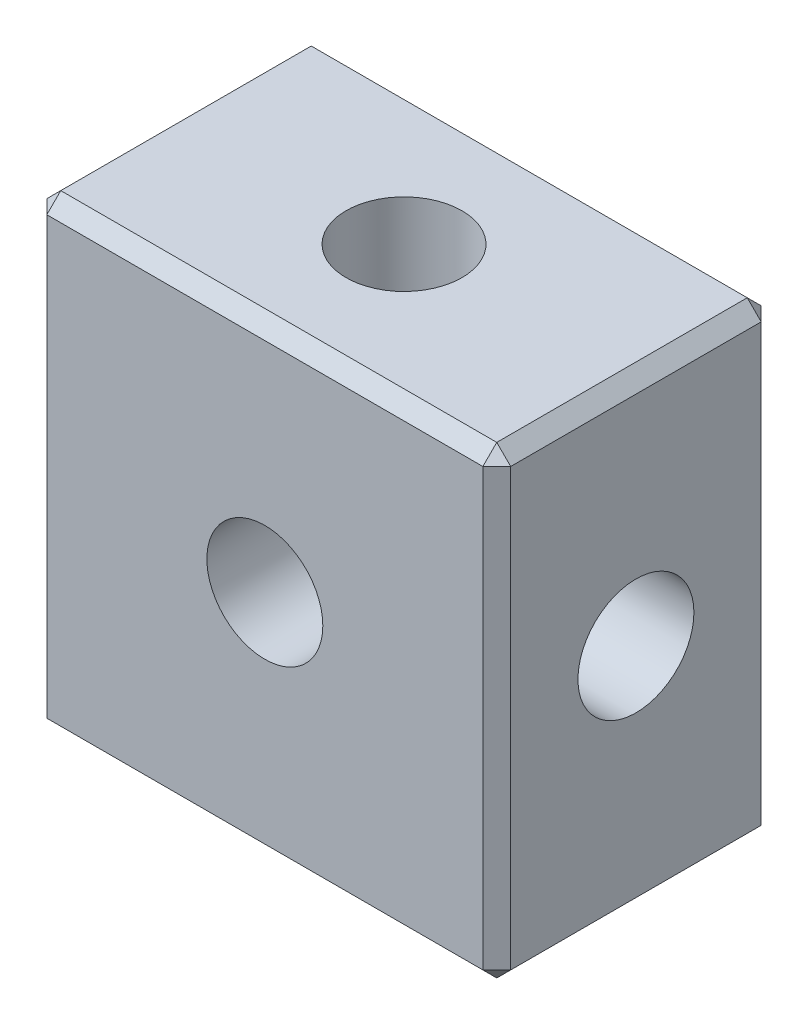
ISO-10303-21;
HEADER;
FILE_DESCRIPTION(('STEP AP214'),'2;1');
FILE_NAME('part.step','',(''),(''),'','','');
FILE_SCHEMA(('AUTOMOTIVE_DESIGN { 1 0 10303 214 1 1 1 1 }'));
ENDSEC;
DATA;
#1=APPLICATION_CONTEXT('core data for automotive mechanical design processes');
#2=APPLICATION_PROTOCOL_DEFINITION('international standard','automotive_design',2000,#1);
#3=PRODUCT_CONTEXT('',#1,'mechanical');
#4=PRODUCT('Part','Part','',(#3));
#5=PRODUCT_RELATED_PRODUCT_CATEGORY('part','',(#4));
#6=PRODUCT_DEFINITION_FORMATION('','',#4);
#7=PRODUCT_DEFINITION_CONTEXT('part definition',#1,'design');
#8=PRODUCT_DEFINITION('design','',#6,#7);
#9=PRODUCT_DEFINITION_SHAPE('','',#8);
#10=(LENGTH_UNIT() NAMED_UNIT(*) SI_UNIT(.MILLI.,.METRE.));
#11=(NAMED_UNIT(*) PLANE_ANGLE_UNIT() SI_UNIT($,.RADIAN.));
#12=(NAMED_UNIT(*) SI_UNIT($,.STERADIAN.) SOLID_ANGLE_UNIT());
#13=UNCERTAINTY_MEASURE_WITH_UNIT(LENGTH_MEASURE(1.E-05),#10,'distance_accuracy_value','');
#14=(GEOMETRIC_REPRESENTATION_CONTEXT(3) GLOBAL_UNCERTAINTY_ASSIGNED_CONTEXT((#13)) GLOBAL_UNIT_ASSIGNED_CONTEXT((#10,
#11,#12)) REPRESENTATION_CONTEXT('',''));
#15=CARTESIAN_POINT('',(0.,0.,0.));
#16=DIRECTION('',(0.,0.,1.));
#17=DIRECTION('',(1.,0.,0.));
#18=AXIS2_PLACEMENT_3D('',#15,#16,#17);
#19=CARTESIAN_POINT('',(0.,0.,3.));
#20=DIRECTION('',(0.,0.,1.));
#21=DIRECTION('',(1.,0.,0.));
#22=AXIS2_PLACEMENT_3D('',#19,#20,#21);
#23=CYLINDRICAL_SURFACE('',#22,1.24999999999999);
#24=CARTESIAN_POINT('',(0.,0.,3.));
#25=DIRECTION('',(0.,0.,1.));
#26=DIRECTION('',(1.,0.,0.));
#27=AXIS2_PLACEMENT_3D('',#24,#25,#26);
#28=CIRCLE('',#27,1.24999999999999);
#29=CARTESIAN_POINT('',(1.24999999999999,0.,3.));
#30=VERTEX_POINT('',#29);
#31=EDGE_CURVE('E335',#30,#30,#28,.T.);
#32=ORIENTED_EDGE('',*,*,#31,.T.);
#33=EDGE_LOOP('',(#32));
#34=FACE_BOUND('',#33,.T.);
#35=CARTESIAN_POINT('',(0.,0.,0.));
#36=DIRECTION('',(0.707106781186547,0.,0.707106781186547));
#37=DIRECTION('',(-0.707106781186547,0.,0.707106781186547));
#38=AXIS2_PLACEMENT_3D('',#35,#36,#37);
#39=ELLIPSE('',#38,1.76776695296636,1.24999999999999);
#40=CARTESIAN_POINT('',(-0.883883476483179,-0.883883476483179,0.883883476483179));
#41=VERTEX_POINT('',#40);
#42=CARTESIAN_POINT('',(-0.883883476483179,0.883883476483179,0.883883476483179));
#43=VERTEX_POINT('',#42);
#44=EDGE_CURVE('E166',#41,#43,#39,.F.);
#45=ORIENTED_EDGE('',*,*,#44,.T.);
#46=CARTESIAN_POINT('',(0.,0.,0.));
#47=DIRECTION('',(0.,-0.707106781186547,0.707106781186547));
#48=DIRECTION('',(0.,0.707106781186547,0.707106781186547));
#49=AXIS2_PLACEMENT_3D('',#46,#47,#48);
#50=ELLIPSE('',#49,1.76776695296636,1.24999999999999);
#51=CARTESIAN_POINT('',(0.883883476483179,0.883883476483179,0.883883476483179));
#52=VERTEX_POINT('',#51);
#53=EDGE_CURVE('E326',#43,#52,#50,.F.);
#54=ORIENTED_EDGE('',*,*,#53,.T.);
#55=CARTESIAN_POINT('',(0.,0.,0.));
#56=DIRECTION('',(-0.707106781186547,0.,0.707106781186547));
#57=DIRECTION('',(0.707106781186547,0.,0.707106781186547));
#58=AXIS2_PLACEMENT_3D('',#55,#56,#57);
#59=ELLIPSE('',#58,1.76776695296636,1.24999999999999);
#60=CARTESIAN_POINT('',(0.883883476483179,-0.883883476483179,0.883883476483179));
#61=VERTEX_POINT('',#60);
#62=EDGE_CURVE('E184',#52,#61,#59,.F.);
#63=ORIENTED_EDGE('',*,*,#62,.T.);
#64=CARTESIAN_POINT('',(0.,0.,0.));
#65=DIRECTION('',(0.,0.707106781186547,0.707106781186547));
#66=DIRECTION('',(0.,-0.707106781186547,0.707106781186547));
#67=AXIS2_PLACEMENT_3D('',#64,#65,#66);
#68=ELLIPSE('',#67,1.76776695296636,1.24999999999999);
#69=EDGE_CURVE('E160',#61,#41,#68,.F.);
#70=ORIENTED_EDGE('',*,*,#69,.T.);
#71=EDGE_LOOP('',(#45,#54,#63,#70));
#72=FACE_BOUND('',#71,.T.);
#73=ADVANCED_FACE('F42',(#34,#72),#23,.F.);
#74=CARTESIAN_POINT('',(5.,-5.,3.));
#75=DIRECTION('',(-1.,0.,0.));
#76=DIRECTION('',(0.,-1.,0.));
#77=AXIS2_PLACEMENT_3D('',#74,#75,#76);
#78=PLANE('',#77);
#79=DIRECTION('',(0.,-1.,0.));
#80=VECTOR('',#79,1.);
#81=CARTESIAN_POINT('',(5.,-5.,2.7));
#82=LINE('',#81,#80);
#83=CARTESIAN_POINT('',(5.,4.7,2.7));
#84=VERTEX_POINT('',#83);
#85=CARTESIAN_POINT('',(5.,-4.7,2.7));
#86=VERTEX_POINT('',#85);
#87=EDGE_CURVE('E218',#84,#86,#82,.T.);
#88=ORIENTED_EDGE('',*,*,#87,.T.);
#89=DIRECTION('',(0.,0.,-1.));
#90=VECTOR('',#89,1.);
#91=CARTESIAN_POINT('',(5.,-4.7,3.));
#92=LINE('',#91,#90);
#93=CARTESIAN_POINT('',(5.,-4.7,-2.7));
#94=VERTEX_POINT('',#93);
#95=EDGE_CURVE('E222',#86,#94,#92,.T.);
#96=ORIENTED_EDGE('',*,*,#95,.T.);
#97=DIRECTION('',(0.,1.,0.));
#98=VECTOR('',#97,1.);
#99=CARTESIAN_POINT('',(5.,5.,-2.7));
#100=LINE('',#99,#98);
#101=CARTESIAN_POINT('',(5.,4.7,-2.7));
#102=VERTEX_POINT('',#101);
#103=EDGE_CURVE('E220',#94,#102,#100,.T.);
#104=ORIENTED_EDGE('',*,*,#103,.T.);
#105=DIRECTION('',(0.,0.,1.));
#106=VECTOR('',#105,1.);
#107=CARTESIAN_POINT('',(5.,4.7,3.));
#108=LINE('',#107,#106);
#109=EDGE_CURVE('E216',#102,#84,#108,.T.);
#110=ORIENTED_EDGE('',*,*,#109,.T.);
#111=EDGE_LOOP('',(#88,#96,#104,#110));
#112=FACE_BOUND('',#111,.T.);
#113=CARTESIAN_POINT('',(5.,0.,0.));
#114=DIRECTION('',(1.,0.,0.));
#115=DIRECTION('',(0.,0.,-1.));
#116=AXIS2_PLACEMENT_3D('',#113,#114,#115);
#117=CIRCLE('',#116,1.24999999999999);
#118=CARTESIAN_POINT('',(5.,0.,-1.24999999999999));
#119=VERTEX_POINT('',#118);
#120=EDGE_CURVE('E329',#119,#119,#117,.T.);
#121=ORIENTED_EDGE('',*,*,#120,.F.);
#122=EDGE_LOOP('',(#121));
#123=FACE_BOUND('',#122,.T.);
#124=ADVANCED_FACE('F358',(#112,#123),#78,.F.);
#125=CARTESIAN_POINT('',(-5.,5.,3.));
#126=DIRECTION('',(0.,-1.,0.));
#127=DIRECTION('',(1.,0.,0.));
#128=AXIS2_PLACEMENT_3D('',#125,#126,#127);
#129=PLANE('',#128);
#130=DIRECTION('',(0.,0.,1.));
#131=VECTOR('',#130,1.);
#132=CARTESIAN_POINT('',(-4.7,5.,3.));
#133=LINE('',#132,#131);
#134=CARTESIAN_POINT('',(-4.7,5.,-2.7));
#135=VERTEX_POINT('',#134);
#136=CARTESIAN_POINT('',(-4.7,5.,2.7));
#137=VERTEX_POINT('',#136);
#138=EDGE_CURVE('E52',#135,#137,#133,.T.);
#139=ORIENTED_EDGE('',*,*,#138,.T.);
#140=DIRECTION('',(1.,0.,0.));
#141=VECTOR('',#140,1.);
#142=CARTESIAN_POINT('',(-5.,5.,2.7));
#143=LINE('',#142,#141);
#144=CARTESIAN_POINT('',(4.7,5.,2.7));
#145=VERTEX_POINT('',#144);
#146=EDGE_CURVE('E11',#137,#145,#143,.T.);
#147=ORIENTED_EDGE('',*,*,#146,.T.);
#148=DIRECTION('',(0.,0.,-1.));
#149=VECTOR('',#148,1.);
#150=CARTESIAN_POINT('',(4.7,5.,3.));
#151=LINE('',#150,#149);
#152=CARTESIAN_POINT('',(4.7,5.,-2.7));
#153=VERTEX_POINT('',#152);
#154=EDGE_CURVE('E234',#145,#153,#151,.T.);
#155=ORIENTED_EDGE('',*,*,#154,.T.);
#156=DIRECTION('',(-1.,0.,0.));
#157=VECTOR('',#156,1.);
#158=CARTESIAN_POINT('',(-5.,5.,-2.7));
#159=LINE('',#158,#157);
#160=EDGE_CURVE('E63',#153,#135,#159,.T.);
#161=ORIENTED_EDGE('',*,*,#160,.T.);
#162=EDGE_LOOP('',(#139,#147,#155,#161));
#163=FACE_BOUND('',#162,.T.);
#164=CARTESIAN_POINT('',(0.,5.,0.));
#165=DIRECTION('',(0.,-1.,0.));
#166=DIRECTION('',(0.,0.,-1.));
#167=AXIS2_PLACEMENT_3D('',#164,#165,#166);
#168=CIRCLE('',#167,1.25);
#169=CARTESIAN_POINT('',(0.,5.,-1.25));
#170=VERTEX_POINT('',#169);
#171=EDGE_CURVE('E177',#170,#170,#168,.T.);
#172=ORIENTED_EDGE('',*,*,#171,.T.);
#173=EDGE_LOOP('',(#172));
#174=FACE_BOUND('',#173,.T.);
#175=ADVANCED_FACE('F363',(#163,#174),#129,.F.);
#176=CARTESIAN_POINT('',(-5.,-5.,3.));
#177=DIRECTION('',(1.,0.,0.));
#178=DIRECTION('',(0.,0.,-1.));
#179=AXIS2_PLACEMENT_3D('',#176,#177,#178);
#180=PLANE('',#179);
#181=DIRECTION('',(0.,-1.,0.));
#182=VECTOR('',#181,1.);
#183=CARTESIAN_POINT('',(-5.,-5.,-2.7));
#184=LINE('',#183,#182);
#185=CARTESIAN_POINT('',(-5.,4.7,-2.7));
#186=VERTEX_POINT('',#185);
#187=CARTESIAN_POINT('',(-5.,-4.7,-2.7));
#188=VERTEX_POINT('',#187);
#189=EDGE_CURVE('E202',#186,#188,#184,.T.);
#190=ORIENTED_EDGE('',*,*,#189,.T.);
#191=DIRECTION('',(0.,0.,1.));
#192=VECTOR('',#191,1.);
#193=CARTESIAN_POINT('',(-5.,-4.7,3.));
#194=LINE('',#193,#192);
#195=CARTESIAN_POINT('',(-5.,-4.7,2.7));
#196=VERTEX_POINT('',#195);
#197=EDGE_CURVE('E204',#188,#196,#194,.T.);
#198=ORIENTED_EDGE('',*,*,#197,.T.);
#199=DIRECTION('',(0.,1.,0.));
#200=VECTOR('',#199,1.);
#201=CARTESIAN_POINT('',(-5.,-5.,2.7));
#202=LINE('',#201,#200);
#203=CARTESIAN_POINT('',(-5.,4.7,2.7));
#204=VERTEX_POINT('',#203);
#205=EDGE_CURVE('E200',#196,#204,#202,.T.);
#206=ORIENTED_EDGE('',*,*,#205,.T.);
#207=DIRECTION('',(0.,0.,-1.));
#208=VECTOR('',#207,1.);
#209=CARTESIAN_POINT('',(-5.,4.7,3.));
#210=LINE('',#209,#208);
#211=EDGE_CURVE('E198',#204,#186,#210,.T.);
#212=ORIENTED_EDGE('',*,*,#211,.T.);
#213=EDGE_LOOP('',(#190,#198,#206,#212));
#214=FACE_BOUND('',#213,.T.);
#215=CARTESIAN_POINT('',(-5.,0.,0.));
#216=DIRECTION('',(1.,0.,0.));
#217=DIRECTION('',(0.,0.,-1.));
#218=AXIS2_PLACEMENT_3D('',#215,#216,#217);
#219=CIRCLE('',#218,1.25);
#220=CARTESIAN_POINT('',(-5.,0.,-1.25));
#221=VERTEX_POINT('',#220);
#222=EDGE_CURVE('E332',#221,#221,#219,.T.);
#223=ORIENTED_EDGE('',*,*,#222,.T.);
#224=EDGE_LOOP('',(#223));
#225=FACE_BOUND('',#224,.T.);
#226=ADVANCED_FACE('F384',(#214,#225),#180,.F.);
#227=CARTESIAN_POINT('',(-5.,-5.,3.));
#228=DIRECTION('',(0.,1.,0.));
#229=DIRECTION('',(-1.,0.,0.));
#230=AXIS2_PLACEMENT_3D('',#227,#228,#229);
#231=PLANE('',#230);
#232=DIRECTION('',(-1.,0.,0.));
#233=VECTOR('',#232,1.);
#234=CARTESIAN_POINT('',(-5.,-5.,2.7));
#235=LINE('',#234,#233);
#236=CARTESIAN_POINT('',(4.7,-5.,2.7));
#237=VERTEX_POINT('',#236);
#238=CARTESIAN_POINT('',(-4.7,-5.,2.7));
#239=VERTEX_POINT('',#238);
#240=EDGE_CURVE('E189',#237,#239,#235,.T.);
#241=ORIENTED_EDGE('',*,*,#240,.T.);
#242=DIRECTION('',(0.,0.,-1.));
#243=VECTOR('',#242,1.);
#244=CARTESIAN_POINT('',(-4.7,-5.,3.));
#245=LINE('',#244,#243);
#246=CARTESIAN_POINT('',(-4.7,-5.,-2.7));
#247=VERTEX_POINT('',#246);
#248=EDGE_CURVE('E195',#239,#247,#245,.T.);
#249=ORIENTED_EDGE('',*,*,#248,.T.);
#250=DIRECTION('',(1.,0.,0.));
#251=VECTOR('',#250,1.);
#252=CARTESIAN_POINT('',(5.,-5.,-2.7));
#253=LINE('',#252,#251);
#254=CARTESIAN_POINT('',(4.7,-5.,-2.7));
#255=VERTEX_POINT('',#254);
#256=EDGE_CURVE('E193',#247,#255,#253,.T.);
#257=ORIENTED_EDGE('',*,*,#256,.T.);
#258=DIRECTION('',(0.,0.,1.));
#259=VECTOR('',#258,1.);
#260=CARTESIAN_POINT('',(4.7,-5.,3.));
#261=LINE('',#260,#259);
#262=EDGE_CURVE('E191',#255,#237,#261,.T.);
#263=ORIENTED_EDGE('',*,*,#262,.T.);
#264=EDGE_LOOP('',(#241,#249,#257,#263));
#265=FACE_BOUND('',#264,.T.);
#266=CARTESIAN_POINT('',(0.,-5.,0.));
#267=DIRECTION('',(0.,-1.,0.));
#268=DIRECTION('',(0.,0.,-1.));
#269=AXIS2_PLACEMENT_3D('',#266,#267,#268);
#270=CIRCLE('',#269,1.24999999999999);
#271=CARTESIAN_POINT('',(0.,-5.,-1.24999999999999));
#272=VERTEX_POINT('',#271);
#273=EDGE_CURVE('E305',#272,#272,#270,.T.);
#274=ORIENTED_EDGE('',*,*,#273,.F.);
#275=EDGE_LOOP('',(#274));
#276=FACE_BOUND('',#275,.T.);
#277=ADVANCED_FACE('F378',(#265,#276),#231,.F.);
#278=CARTESIAN_POINT('',(0.,0.,3.));
#279=DIRECTION('',(0.,0.,-1.));
#280=DIRECTION('',(-1.,0.,0.));
#281=AXIS2_PLACEMENT_3D('',#278,#279,#280);
#282=PLANE('',#281);
#283=DIRECTION('',(1.,0.,0.));
#284=VECTOR('',#283,1.);
#285=CARTESIAN_POINT('',(0.,-4.7,3.));
#286=LINE('',#285,#284);
#287=CARTESIAN_POINT('',(-4.7,-4.7,3.));
#288=VERTEX_POINT('',#287);
#289=CARTESIAN_POINT('',(4.7,-4.7,3.));
#290=VERTEX_POINT('',#289);
#291=EDGE_CURVE('E229',#288,#290,#286,.T.);
#292=ORIENTED_EDGE('',*,*,#291,.T.);
#293=DIRECTION('',(0.,1.,0.));
#294=VECTOR('',#293,1.);
#295=CARTESIAN_POINT('',(4.7,0.,3.));
#296=LINE('',#295,#294);
#297=CARTESIAN_POINT('',(4.7,4.7,3.));
#298=VERTEX_POINT('',#297);
#299=EDGE_CURVE('E231',#290,#298,#296,.T.);
#300=ORIENTED_EDGE('',*,*,#299,.T.);
#301=DIRECTION('',(-1.,0.,0.));
#302=VECTOR('',#301,1.);
#303=CARTESIAN_POINT('',(0.,4.7,3.));
#304=LINE('',#303,#302);
#305=CARTESIAN_POINT('',(-4.7,4.7,3.));
#306=VERTEX_POINT('',#305);
#307=EDGE_CURVE('E225',#298,#306,#304,.T.);
#308=ORIENTED_EDGE('',*,*,#307,.T.);
#309=DIRECTION('',(0.,-1.,0.));
#310=VECTOR('',#309,1.);
#311=CARTESIAN_POINT('',(-4.7,0.,3.));
#312=LINE('',#311,#310);
#313=EDGE_CURVE('E227',#306,#288,#312,.T.);
#314=ORIENTED_EDGE('',*,*,#313,.T.);
#315=EDGE_LOOP('',(#292,#300,#308,#314));
#316=FACE_BOUND('',#315,.T.);
#317=ORIENTED_EDGE('',*,*,#31,.F.);
#318=EDGE_LOOP('',(#317));
#319=FACE_BOUND('',#318,.T.);
#320=ADVANCED_FACE('F372',(#316,#319),#282,.F.);
#321=CARTESIAN_POINT('',(0.,0.,-3.));
#322=DIRECTION('',(0.,0.,-1.));
#323=DIRECTION('',(-1.,0.,0.));
#324=AXIS2_PLACEMENT_3D('',#321,#322,#323);
#325=PLANE('',#324);
#326=DIRECTION('',(-1.,0.,0.));
#327=VECTOR('',#326,1.);
#328=CARTESIAN_POINT('',(-5.,-4.7,-3.));
#329=LINE('',#328,#327);
#330=CARTESIAN_POINT('',(4.7,-4.7,-3.));
#331=VERTEX_POINT('',#330);
#332=CARTESIAN_POINT('',(-4.7,-4.7,-3.));
#333=VERTEX_POINT('',#332);
#334=EDGE_CURVE('E211',#331,#333,#329,.T.);
#335=ORIENTED_EDGE('',*,*,#334,.T.);
#336=DIRECTION('',(0.,1.,0.));
#337=VECTOR('',#336,1.);
#338=CARTESIAN_POINT('',(-4.7,5.,-3.));
#339=LINE('',#338,#337);
#340=CARTESIAN_POINT('',(-4.7,4.7,-3.));
#341=VERTEX_POINT('',#340);
#342=EDGE_CURVE('E213',#333,#341,#339,.T.);
#343=ORIENTED_EDGE('',*,*,#342,.T.);
#344=DIRECTION('',(1.,0.,0.));
#345=VECTOR('',#344,1.);
#346=CARTESIAN_POINT('',(5.,4.7,-3.));
#347=LINE('',#346,#345);
#348=CARTESIAN_POINT('',(4.7,4.7,-3.));
#349=VERTEX_POINT('',#348);
#350=EDGE_CURVE('E207',#341,#349,#347,.T.);
#351=ORIENTED_EDGE('',*,*,#350,.T.);
#352=DIRECTION('',(0.,-1.,0.));
#353=VECTOR('',#352,1.);
#354=CARTESIAN_POINT('',(4.7,-5.,-3.));
#355=LINE('',#354,#353);
#356=EDGE_CURVE('E209',#349,#331,#355,.T.);
#357=ORIENTED_EDGE('',*,*,#356,.T.);
#358=EDGE_LOOP('',(#335,#343,#351,#357));
#359=FACE_BOUND('',#358,.T.);
#360=CARTESIAN_POINT('',(0.,0.,-3.));
#361=DIRECTION('',(0.,0.,1.));
#362=DIRECTION('',(1.,0.,0.));
#363=AXIS2_PLACEMENT_3D('',#360,#361,#362);
#364=CIRCLE('',#363,1.25);
#365=CARTESIAN_POINT('',(1.25,0.,-3.));
#366=VERTEX_POINT('',#365);
#367=EDGE_CURVE('E338',#366,#366,#364,.T.);
#368=ORIENTED_EDGE('',*,*,#367,.T.);
#369=EDGE_LOOP('',(#368));
#370=FACE_BOUND('',#369,.T.);
#371=ADVANCED_FACE('F368',(#359,#370),#325,.T.);
#372=CARTESIAN_POINT('',(0.,0.,0.));
#373=DIRECTION('',(-0.707106781186547,0.,0.707106781186547));
#374=DIRECTION('',(0.707106781186547,0.,0.707106781186547));
#375=AXIS2_PLACEMENT_3D('',#372,#373,#374);
#376=ELLIPSE('',#375,1.76776695296636,1.24999999999999);
#377=CARTESIAN_POINT('',(-0.883883476483179,0.883883476483179,-0.883883476483179));
#378=VERTEX_POINT('',#377);
#379=CARTESIAN_POINT('',(-0.883883476483179,-0.883883476483179,-0.883883476483179));
#380=VERTEX_POINT('',#379);
#381=EDGE_CURVE('E176',#378,#380,#376,.T.);
#382=ORIENTED_EDGE('',*,*,#381,.T.);
#383=CARTESIAN_POINT('',(0.,0.,0.));
#384=DIRECTION('',(0.,-0.707106781186547,0.707106781186547));
#385=DIRECTION('',(0.,0.707106781186547,0.707106781186547));
#386=AXIS2_PLACEMENT_3D('',#383,#384,#385);
#387=ELLIPSE('',#386,1.76776695296636,1.24999999999999);
#388=CARTESIAN_POINT('',(0.883883476483179,-0.883883476483179,-0.883883476483179));
#389=VERTEX_POINT('',#388);
#390=EDGE_CURVE('E157',#380,#389,#387,.T.);
#391=ORIENTED_EDGE('',*,*,#390,.T.);
#392=CARTESIAN_POINT('',(0.,0.,0.));
#393=DIRECTION('',(0.707106781186547,0.,0.707106781186547));
#394=DIRECTION('',(-0.707106781186547,0.,0.707106781186547));
#395=AXIS2_PLACEMENT_3D('',#392,#393,#394);
#396=ELLIPSE('',#395,1.76776695296636,1.24999999999999);
#397=CARTESIAN_POINT('',(0.883883476483179,0.883883476483179,-0.883883476483179));
#398=VERTEX_POINT('',#397);
#399=EDGE_CURVE('E174',#389,#398,#396,.T.);
#400=ORIENTED_EDGE('',*,*,#399,.T.);
#401=CARTESIAN_POINT('',(0.,0.,0.));
#402=DIRECTION('',(0.,0.707106781186547,0.707106781186547));
#403=DIRECTION('',(0.,-0.707106781186547,0.707106781186547));
#404=AXIS2_PLACEMENT_3D('',#401,#402,#403);
#405=ELLIPSE('',#404,1.76776695296636,1.24999999999999);
#406=EDGE_CURVE('E324',#398,#378,#405,.T.);
#407=ORIENTED_EDGE('',*,*,#406,.T.);
#408=EDGE_LOOP('',(#382,#391,#400,#407));
#409=FACE_BOUND('',#408,.T.);
#410=ORIENTED_EDGE('',*,*,#367,.F.);
#411=EDGE_LOOP('',(#410));
#412=FACE_BOUND('',#411,.T.);
#413=ADVANCED_FACE('F171',(#409,#412),#23,.F.);
#414=CARTESIAN_POINT('',(5.,0.,0.));
#415=DIRECTION('',(1.,0.,0.));
#416=DIRECTION('',(0.,0.,-1.));
#417=AXIS2_PLACEMENT_3D('',#414,#415,#416);
#418=CYLINDRICAL_SURFACE('',#417,1.24999999999999);
#419=ORIENTED_EDGE('',*,*,#120,.T.);
#420=EDGE_LOOP('',(#419));
#421=FACE_BOUND('',#420,.T.);
#422=ORIENTED_EDGE('',*,*,#62,.F.);
#423=CARTESIAN_POINT('',(0.,0.,0.));
#424=DIRECTION('',(0.707106781186547,-0.707106781186547,0.));
#425=DIRECTION('',(0.707106781186547,0.707106781186547,0.));
#426=AXIS2_PLACEMENT_3D('',#423,#424,#425);
#427=ELLIPSE('',#426,1.76776695296636,1.24999999999999);
#428=EDGE_CURVE('E165',#52,#398,#427,.F.);
#429=ORIENTED_EDGE('',*,*,#428,.T.);
#430=ORIENTED_EDGE('',*,*,#399,.F.);
#431=CARTESIAN_POINT('',(0.,0.,0.));
#432=DIRECTION('',(0.707106781186547,0.707106781186547,0.));
#433=DIRECTION('',(0.707106781186547,-0.707106781186547,0.));
#434=AXIS2_PLACEMENT_3D('',#431,#432,#433);
#435=ELLIPSE('',#434,1.76776695296636,1.24999999999999);
#436=EDGE_CURVE('E154',#389,#61,#435,.F.);
#437=ORIENTED_EDGE('',*,*,#436,.T.);
#438=EDGE_LOOP('',(#422,#429,#430,#437));
#439=FACE_BOUND('',#438,.T.);
#440=ADVANCED_FACE('F180',(#421,#439),#418,.F.);
#441=ORIENTED_EDGE('',*,*,#222,.F.);
#442=EDGE_LOOP('',(#441));
#443=FACE_BOUND('',#442,.T.);
#444=ORIENTED_EDGE('',*,*,#44,.F.);
#445=CARTESIAN_POINT('',(0.,0.,0.));
#446=DIRECTION('',(0.707106781186547,-0.707106781186547,0.));
#447=DIRECTION('',(0.707106781186547,0.707106781186547,0.));
#448=AXIS2_PLACEMENT_3D('',#445,#446,#447);
#449=ELLIPSE('',#448,1.76776695296636,1.24999999999999);
#450=EDGE_CURVE('E319',#41,#380,#449,.T.);
#451=ORIENTED_EDGE('',*,*,#450,.T.);
#452=ORIENTED_EDGE('',*,*,#381,.F.);
#453=CARTESIAN_POINT('',(0.,0.,0.));
#454=DIRECTION('',(0.707106781186547,0.707106781186547,0.));
#455=DIRECTION('',(0.707106781186547,-0.707106781186547,0.));
#456=AXIS2_PLACEMENT_3D('',#453,#454,#455);
#457=ELLIPSE('',#456,1.76776695296636,1.24999999999999);
#458=EDGE_CURVE('E321',#378,#43,#457,.T.);
#459=ORIENTED_EDGE('',*,*,#458,.T.);
#460=EDGE_LOOP('',(#444,#451,#452,#459));
#461=FACE_BOUND('',#460,.T.);
#462=ADVANCED_FACE('F345',(#443,#461),#418,.F.);
#463=CARTESIAN_POINT('',(0.,-5.,0.));
#464=DIRECTION('',(0.,-1.,0.));
#465=DIRECTION('',(0.,0.,-1.));
#466=AXIS2_PLACEMENT_3D('',#463,#464,#465);
#467=CYLINDRICAL_SURFACE('',#466,1.24999999999999);
#468=ORIENTED_EDGE('',*,*,#273,.T.);
#469=EDGE_LOOP('',(#468));
#470=FACE_BOUND('',#469,.T.);
#471=ORIENTED_EDGE('',*,*,#69,.F.);
#472=ORIENTED_EDGE('',*,*,#436,.F.);
#473=ORIENTED_EDGE('',*,*,#390,.F.);
#474=ORIENTED_EDGE('',*,*,#450,.F.);
#475=EDGE_LOOP('',(#471,#472,#473,#474));
#476=FACE_BOUND('',#475,.T.);
#477=ADVANCED_FACE('F156',(#470,#476),#467,.F.);
#478=ORIENTED_EDGE('',*,*,#171,.F.);
#479=EDGE_LOOP('',(#478));
#480=FACE_BOUND('',#479,.T.);
#481=ORIENTED_EDGE('',*,*,#53,.F.);
#482=ORIENTED_EDGE('',*,*,#458,.F.);
#483=ORIENTED_EDGE('',*,*,#406,.F.);
#484=ORIENTED_EDGE('',*,*,#428,.F.);
#485=EDGE_LOOP('',(#481,#482,#483,#484));
#486=FACE_BOUND('',#485,.T.);
#487=ADVANCED_FACE('F343',(#480,#486),#467,.F.);
#488=CARTESIAN_POINT('',(4.7,5.,3.));
#489=DIRECTION('',(-0.707106781186547,-0.707106781186547,0.));
#490=DIRECTION('',(0.,0.,-1.));
#491=AXIS2_PLACEMENT_3D('',#488,#489,#490);
#492=PLANE('',#491);
#493=DIRECTION('',(0.707106781186548,-0.707106781186548,0.));
#494=VECTOR('',#493,1.);
#495=CARTESIAN_POINT('',(4.85,4.85,2.7));
#496=LINE('',#495,#494);
#497=EDGE_CURVE('E47',#84,#145,#496,.F.);
#498=ORIENTED_EDGE('',*,*,#497,.F.);
#499=ORIENTED_EDGE('',*,*,#109,.F.);
#500=DIRECTION('',(-0.707106781186548,0.707106781186548,0.));
#501=VECTOR('',#500,1.);
#502=CARTESIAN_POINT('',(5.,4.7,-2.7));
#503=LINE('',#502,#501);
#504=EDGE_CURVE('E298',#153,#102,#503,.F.);
#505=ORIENTED_EDGE('',*,*,#504,.F.);
#506=ORIENTED_EDGE('',*,*,#154,.F.);
#507=EDGE_LOOP('',(#498,#499,#505,#506));
#508=FACE_BOUND('',#507,.T.);
#509=ADVANCED_FACE('F45',(#508),#492,.F.);
#510=CARTESIAN_POINT('',(4.7,4.7,3.));
#511=DIRECTION('',(0.577350269189625,0.577350269189625,0.577350269189628));
#512=DIRECTION('',(0.707106781186549,0.,-0.707106781186545));
#513=AXIS2_PLACEMENT_3D('',#510,#511,#512);
#514=PLANE('',#513);
#515=DIRECTION('',(-0.707106781186548,0.,0.707106781186547));
#516=VECTOR('',#515,1.);
#517=CARTESIAN_POINT('',(4.7,4.7,3.));
#518=LINE('',#517,#516);
#519=EDGE_CURVE('E294',#84,#298,#518,.T.);
#520=ORIENTED_EDGE('',*,*,#519,.F.);
#521=ORIENTED_EDGE('',*,*,#497,.T.);
#522=DIRECTION('',(0.,0.707106781186548,-0.707106781186547));
#523=VECTOR('',#522,1.);
#524=CARTESIAN_POINT('',(4.7,4.7,3.));
#525=LINE('',#524,#523);
#526=EDGE_CURVE('E297',#298,#145,#525,.T.);
#527=ORIENTED_EDGE('',*,*,#526,.F.);
#528=EDGE_LOOP('',(#520,#521,#527));
#529=FACE_BOUND('',#528,.T.);
#530=ADVANCED_FACE('F516',(#529),#514,.T.);
#531=CARTESIAN_POINT('',(5.,4.7,-2.7));
#532=DIRECTION('',(0.577350269189625,0.577350269189625,-0.577350269189628));
#533=DIRECTION('',(-0.707106781186549,0.,-0.707106781186545));
#534=AXIS2_PLACEMENT_3D('',#531,#532,#533);
#535=PLANE('',#534);
#536=DIRECTION('',(0.,0.707106781186548,0.707106781186547));
#537=VECTOR('',#536,1.);
#538=CARTESIAN_POINT('',(4.7,4.85,-2.85));
#539=LINE('',#538,#537);
#540=EDGE_CURVE('E288',#153,#349,#539,.F.);
#541=ORIENTED_EDGE('',*,*,#540,.F.);
#542=ORIENTED_EDGE('',*,*,#504,.T.);
#543=DIRECTION('',(-0.707106781186548,0.,-0.707106781186547));
#544=VECTOR('',#543,1.);
#545=CARTESIAN_POINT('',(5.,4.7,-2.7));
#546=LINE('',#545,#544);
#547=EDGE_CURVE('E291',#349,#102,#546,.F.);
#548=ORIENTED_EDGE('',*,*,#547,.F.);
#549=EDGE_LOOP('',(#541,#542,#548));
#550=FACE_BOUND('',#549,.T.);
#551=ADVANCED_FACE('F510',(#550),#535,.T.);
#552=CARTESIAN_POINT('',(0.,4.7,3.));
#553=DIRECTION('',(0.,-0.707106781186547,-0.707106781186548));
#554=DIRECTION('',(-1.,0.,0.));
#555=AXIS2_PLACEMENT_3D('',#552,#553,#554);
#556=PLANE('',#555);
#557=ORIENTED_EDGE('',*,*,#526,.T.);
#558=ORIENTED_EDGE('',*,*,#146,.F.);
#559=DIRECTION('',(0.,-0.707106781186548,0.707106781186547));
#560=VECTOR('',#559,1.);
#561=CARTESIAN_POINT('',(-4.7,4.85,2.85));
#562=LINE('',#561,#560);
#563=EDGE_CURVE('E282',#306,#137,#562,.F.);
#564=ORIENTED_EDGE('',*,*,#563,.F.);
#565=ORIENTED_EDGE('',*,*,#307,.F.);
#566=EDGE_LOOP('',(#557,#558,#564,#565));
#567=FACE_BOUND('',#566,.T.);
#568=ADVANCED_FACE('F503',(#567),#556,.F.);
#569=CARTESIAN_POINT('',(4.7,0.,3.));
#570=DIRECTION('',(-0.707106781186547,0.,-0.707106781186548));
#571=DIRECTION('',(0.,1.,0.));
#572=AXIS2_PLACEMENT_3D('',#569,#570,#571);
#573=PLANE('',#572);
#574=ORIENTED_EDGE('',*,*,#519,.T.);
#575=ORIENTED_EDGE('',*,*,#299,.F.);
#576=DIRECTION('',(0.707106781186548,0.,-0.707106781186547));
#577=VECTOR('',#576,1.);
#578=CARTESIAN_POINT('',(4.85,-4.7,2.85));
#579=LINE('',#578,#577);
#580=EDGE_CURVE('E279',#86,#290,#579,.F.);
#581=ORIENTED_EDGE('',*,*,#580,.F.);
#582=ORIENTED_EDGE('',*,*,#87,.F.);
#583=EDGE_LOOP('',(#574,#575,#581,#582));
#584=FACE_BOUND('',#583,.T.);
#585=ADVANCED_FACE('F496',(#584),#573,.F.);
#586=CARTESIAN_POINT('',(5.,-4.7,3.));
#587=DIRECTION('',(-0.707106781186548,0.707106781186546,0.));
#588=DIRECTION('',(0.,0.,-1.));
#589=AXIS2_PLACEMENT_3D('',#586,#587,#588);
#590=PLANE('',#589);
#591=DIRECTION('',(0.707106781186547,0.707106781186549,0.));
#592=VECTOR('',#591,1.);
#593=CARTESIAN_POINT('',(4.7,-5.,-2.7));
#594=LINE('',#593,#592);
#595=EDGE_CURVE('E273',#94,#255,#594,.F.);
#596=ORIENTED_EDGE('',*,*,#595,.F.);
#597=ORIENTED_EDGE('',*,*,#95,.F.);
#598=DIRECTION('',(-0.707106781186547,-0.707106781186549,0.));
#599=VECTOR('',#598,1.);
#600=CARTESIAN_POINT('',(4.7,-5.,2.7));
#601=LINE('',#600,#599);
#602=EDGE_CURVE('E276',#237,#86,#601,.F.);
#603=ORIENTED_EDGE('',*,*,#602,.F.);
#604=ORIENTED_EDGE('',*,*,#262,.F.);
#605=EDGE_LOOP('',(#596,#597,#603,#604));
#606=FACE_BOUND('',#605,.T.);
#607=ADVANCED_FACE('F489',(#606),#590,.F.);
#608=CARTESIAN_POINT('',(5.,-5.,-2.7));
#609=DIRECTION('',(0.707106781186547,0.,-0.707106781186548));
#610=DIRECTION('',(0.,-1.,0.));
#611=AXIS2_PLACEMENT_3D('',#608,#609,#610);
#612=PLANE('',#611);
#613=ORIENTED_EDGE('',*,*,#547,.T.);
#614=ORIENTED_EDGE('',*,*,#103,.F.);
#615=DIRECTION('',(0.707106781186548,0.,0.707106781186547));
#616=VECTOR('',#615,1.);
#617=CARTESIAN_POINT('',(4.85,-4.7,-2.85));
#618=LINE('',#617,#616);
#619=EDGE_CURVE('E271',#331,#94,#618,.T.);
#620=ORIENTED_EDGE('',*,*,#619,.F.);
#621=ORIENTED_EDGE('',*,*,#356,.F.);
#622=EDGE_LOOP('',(#613,#614,#620,#621));
#623=FACE_BOUND('',#622,.T.);
#624=ADVANCED_FACE('F482',(#623),#612,.T.);
#625=CARTESIAN_POINT('',(-5.,5.,-2.7));
#626=DIRECTION('',(0.,0.707106781186547,-0.707106781186548));
#627=DIRECTION('',(1.,0.,0.));
#628=AXIS2_PLACEMENT_3D('',#625,#626,#627);
#629=PLANE('',#628);
#630=ORIENTED_EDGE('',*,*,#540,.T.);
#631=ORIENTED_EDGE('',*,*,#350,.F.);
#632=DIRECTION('',(0.,-0.707106781186548,-0.707106781186547));
#633=VECTOR('',#632,1.);
#634=CARTESIAN_POINT('',(-4.7,4.7,-3.));
#635=LINE('',#634,#633);
#636=EDGE_CURVE('E268',#135,#341,#635,.T.);
#637=ORIENTED_EDGE('',*,*,#636,.F.);
#638=ORIENTED_EDGE('',*,*,#160,.F.);
#639=EDGE_LOOP('',(#630,#631,#637,#638));
#640=FACE_BOUND('',#639,.T.);
#641=ADVANCED_FACE('F475',(#640),#629,.T.);
#642=CARTESIAN_POINT('',(-5.,4.7,3.));
#643=DIRECTION('',(0.707106781186547,-0.707106781186547,0.));
#644=DIRECTION('',(0.,0.,-1.));
#645=AXIS2_PLACEMENT_3D('',#642,#643,#644);
#646=PLANE('',#645);
#647=DIRECTION('',(0.707106781186547,0.707106781186547,0.));
#648=VECTOR('',#647,1.);
#649=CARTESIAN_POINT('',(-5.,4.7,2.7));
#650=LINE('',#649,#648);
#651=EDGE_CURVE('E285',#137,#204,#650,.F.);
#652=ORIENTED_EDGE('',*,*,#651,.F.);
#653=ORIENTED_EDGE('',*,*,#138,.F.);
#654=DIRECTION('',(-0.707106781186547,-0.707106781186547,0.));
#655=VECTOR('',#654,1.);
#656=CARTESIAN_POINT('',(-4.85,4.85,-2.7));
#657=LINE('',#656,#655);
#658=EDGE_CURVE('E265',#186,#135,#657,.F.);
#659=ORIENTED_EDGE('',*,*,#658,.F.);
#660=ORIENTED_EDGE('',*,*,#211,.F.);
#661=EDGE_LOOP('',(#652,#653,#659,#660));
#662=FACE_BOUND('',#661,.T.);
#663=ADVANCED_FACE('F468',(#662),#646,.F.);
#664=CARTESIAN_POINT('',(-5.,4.7,2.7));
#665=DIRECTION('',(-0.577350269189626,0.577350269189626,0.577350269189626));
#666=DIRECTION('',(0.707106781186547,0.,0.707106781186547));
#667=AXIS2_PLACEMENT_3D('',#664,#665,#666);
#668=PLANE('',#667);
#669=ORIENTED_EDGE('',*,*,#563,.T.);
#670=ORIENTED_EDGE('',*,*,#651,.T.);
#671=DIRECTION('',(-0.707106781186547,0.,-0.707106781186547));
#672=VECTOR('',#671,1.);
#673=CARTESIAN_POINT('',(-5.,4.7,2.7));
#674=LINE('',#673,#672);
#675=EDGE_CURVE('E262',#306,#204,#674,.T.);
#676=ORIENTED_EDGE('',*,*,#675,.F.);
#677=EDGE_LOOP('',(#669,#670,#676));
#678=FACE_BOUND('',#677,.T.);
#679=ADVANCED_FACE('F461',(#678),#668,.T.);
#680=CARTESIAN_POINT('',(4.7,-5.,2.7));
#681=DIRECTION('',(0.577350269189626,-0.577350269189625,0.577350269189626));
#682=DIRECTION('',(0.707106781186547,0.,-0.707106781186547));
#683=AXIS2_PLACEMENT_3D('',#680,#681,#682);
#684=PLANE('',#683);
#685=ORIENTED_EDGE('',*,*,#602,.T.);
#686=ORIENTED_EDGE('',*,*,#580,.T.);
#687=DIRECTION('',(0.,0.707106781186547,0.707106781186548));
#688=VECTOR('',#687,1.);
#689=CARTESIAN_POINT('',(4.7,-5.,2.7));
#690=LINE('',#689,#688);
#691=EDGE_CURVE('E259',#237,#290,#690,.T.);
#692=ORIENTED_EDGE('',*,*,#691,.F.);
#693=EDGE_LOOP('',(#685,#686,#692));
#694=FACE_BOUND('',#693,.T.);
#695=ADVANCED_FACE('F454',(#694),#684,.T.);
#696=CARTESIAN_POINT('',(4.7,-5.,-2.7));
#697=DIRECTION('',(0.577350269189626,-0.577350269189625,-0.577350269189626));
#698=DIRECTION('',(-0.707106781186547,0.,-0.707106781186547));
#699=AXIS2_PLACEMENT_3D('',#696,#697,#698);
#700=PLANE('',#699);
#701=ORIENTED_EDGE('',*,*,#619,.T.);
#702=ORIENTED_EDGE('',*,*,#595,.T.);
#703=DIRECTION('',(0.,0.707106781186547,-0.707106781186548));
#704=VECTOR('',#703,1.);
#705=CARTESIAN_POINT('',(4.7,-5.,-2.7));
#706=LINE('',#705,#704);
#707=EDGE_CURVE('E256',#331,#255,#706,.F.);
#708=ORIENTED_EDGE('',*,*,#707,.F.);
#709=EDGE_LOOP('',(#701,#702,#708));
#710=FACE_BOUND('',#709,.T.);
#711=ADVANCED_FACE('F447',(#710),#700,.T.);
#712=CARTESIAN_POINT('',(-4.7,4.7,-3.));
#713=DIRECTION('',(-0.577350269189626,0.577350269189626,-0.577350269189626));
#714=DIRECTION('',(-0.707106781186547,0.,0.707106781186547));
#715=AXIS2_PLACEMENT_3D('',#712,#713,#714);
#716=PLANE('',#715);
#717=ORIENTED_EDGE('',*,*,#658,.T.);
#718=ORIENTED_EDGE('',*,*,#636,.T.);
#719=DIRECTION('',(-0.707106781186547,0.,0.707106781186547));
#720=VECTOR('',#719,1.);
#721=CARTESIAN_POINT('',(-4.7,4.7,-3.));
#722=LINE('',#721,#720);
#723=EDGE_CURVE('E254',#186,#341,#722,.F.);
#724=ORIENTED_EDGE('',*,*,#723,.F.);
#725=EDGE_LOOP('',(#717,#718,#724));
#726=FACE_BOUND('',#725,.T.);
#727=ADVANCED_FACE('F440',(#726),#716,.T.);
#728=CARTESIAN_POINT('',(-4.7,0.,3.));
#729=DIRECTION('',(0.707106781186547,0.,-0.707106781186547));
#730=DIRECTION('',(0.,-1.,0.));
#731=AXIS2_PLACEMENT_3D('',#728,#729,#730);
#732=PLANE('',#731);
#733=ORIENTED_EDGE('',*,*,#675,.T.);
#734=ORIENTED_EDGE('',*,*,#205,.F.);
#735=DIRECTION('',(0.707106781186547,0.,0.707106781186547));
#736=VECTOR('',#735,1.);
#737=CARTESIAN_POINT('',(-5.,-4.7,2.7));
#738=LINE('',#737,#736);
#739=EDGE_CURVE('E251',#288,#196,#738,.F.);
#740=ORIENTED_EDGE('',*,*,#739,.F.);
#741=ORIENTED_EDGE('',*,*,#313,.F.);
#742=EDGE_LOOP('',(#733,#734,#740,#741));
#743=FACE_BOUND('',#742,.T.);
#744=ADVANCED_FACE('F433',(#743),#732,.F.);
#745=CARTESIAN_POINT('',(0.,-4.7,3.));
#746=DIRECTION('',(0.,0.707106781186548,-0.707106781186547));
#747=DIRECTION('',(1.,0.,0.));
#748=AXIS2_PLACEMENT_3D('',#745,#746,#747);
#749=PLANE('',#748);
#750=ORIENTED_EDGE('',*,*,#691,.T.);
#751=ORIENTED_EDGE('',*,*,#291,.F.);
#752=DIRECTION('',(0.,-0.707106781186547,-0.707106781186548));
#753=VECTOR('',#752,1.);
#754=CARTESIAN_POINT('',(-4.7,-4.85,2.85));
#755=LINE('',#754,#753);
#756=EDGE_CURVE('E248',#239,#288,#755,.F.);
#757=ORIENTED_EDGE('',*,*,#756,.F.);
#758=ORIENTED_EDGE('',*,*,#240,.F.);
#759=EDGE_LOOP('',(#750,#751,#757,#758));
#760=FACE_BOUND('',#759,.T.);
#761=ADVANCED_FACE('F426',(#760),#749,.F.);
#762=CARTESIAN_POINT('',(-5.,-5.,-2.7));
#763=DIRECTION('',(0.,-0.707106781186548,-0.707106781186547));
#764=DIRECTION('',(-1.,0.,0.));
#765=AXIS2_PLACEMENT_3D('',#762,#763,#764);
#766=PLANE('',#765);
#767=ORIENTED_EDGE('',*,*,#707,.T.);
#768=ORIENTED_EDGE('',*,*,#256,.F.);
#769=DIRECTION('',(0.,-0.707106781186547,0.707106781186548));
#770=VECTOR('',#769,1.);
#771=CARTESIAN_POINT('',(-4.7,-5.,-2.7));
#772=LINE('',#771,#770);
#773=EDGE_CURVE('E245',#333,#247,#772,.T.);
#774=ORIENTED_EDGE('',*,*,#773,.F.);
#775=ORIENTED_EDGE('',*,*,#334,.F.);
#776=EDGE_LOOP('',(#767,#768,#774,#775));
#777=FACE_BOUND('',#776,.T.);
#778=ADVANCED_FACE('F419',(#777),#766,.T.);
#779=CARTESIAN_POINT('',(-5.,-5.,-2.7));
#780=DIRECTION('',(-0.707106781186547,0.,-0.707106781186547));
#781=DIRECTION('',(0.,1.,0.));
#782=AXIS2_PLACEMENT_3D('',#779,#780,#781);
#783=PLANE('',#782);
#784=ORIENTED_EDGE('',*,*,#723,.T.);
#785=ORIENTED_EDGE('',*,*,#342,.F.);
#786=DIRECTION('',(0.707106781186547,0.,-0.707106781186547));
#787=VECTOR('',#786,1.);
#788=CARTESIAN_POINT('',(-4.85,-4.7,-2.85));
#789=LINE('',#788,#787);
#790=EDGE_CURVE('E242',#188,#333,#789,.T.);
#791=ORIENTED_EDGE('',*,*,#790,.F.);
#792=ORIENTED_EDGE('',*,*,#189,.F.);
#793=EDGE_LOOP('',(#784,#785,#791,#792));
#794=FACE_BOUND('',#793,.T.);
#795=ADVANCED_FACE('F412',(#794),#783,.T.);
#796=CARTESIAN_POINT('',(-5.,-4.7,2.7));
#797=DIRECTION('',(-0.577350269189626,-0.577350269189626,0.577350269189626));
#798=DIRECTION('',(0.707106781186547,0.,0.707106781186547));
#799=AXIS2_PLACEMENT_3D('',#796,#797,#798);
#800=PLANE('',#799);
#801=ORIENTED_EDGE('',*,*,#756,.T.);
#802=ORIENTED_EDGE('',*,*,#739,.T.);
#803=DIRECTION('',(-0.707106781186547,0.707106781186547,0.));
#804=VECTOR('',#803,1.);
#805=CARTESIAN_POINT('',(-5.,-4.7,2.7));
#806=LINE('',#805,#804);
#807=EDGE_CURVE('E240',#239,#196,#806,.T.);
#808=ORIENTED_EDGE('',*,*,#807,.F.);
#809=EDGE_LOOP('',(#801,#802,#808));
#810=FACE_BOUND('',#809,.T.);
#811=ADVANCED_FACE('F405',(#810),#800,.T.);
#812=CARTESIAN_POINT('',(-4.7,-5.,-2.7));
#813=DIRECTION('',(-0.577350269189626,-0.577350269189626,-0.577350269189626));
#814=DIRECTION('',(-0.707106781186547,0.,0.707106781186547));
#815=AXIS2_PLACEMENT_3D('',#812,#813,#814);
#816=PLANE('',#815);
#817=ORIENTED_EDGE('',*,*,#790,.T.);
#818=ORIENTED_EDGE('',*,*,#773,.T.);
#819=DIRECTION('',(0.707106781186547,-0.707106781186547,0.));
#820=VECTOR('',#819,1.);
#821=CARTESIAN_POINT('',(-4.7,-5.,-2.7));
#822=LINE('',#821,#820);
#823=EDGE_CURVE('E238',#188,#247,#822,.T.);
#824=ORIENTED_EDGE('',*,*,#823,.F.);
#825=EDGE_LOOP('',(#817,#818,#824));
#826=FACE_BOUND('',#825,.T.);
#827=ADVANCED_FACE('F398',(#826),#816,.T.);
#828=CARTESIAN_POINT('',(-4.7,-5.,3.));
#829=DIRECTION('',(0.707106781186547,0.707106781186547,0.));
#830=DIRECTION('',(0.,0.,-1.));
#831=AXIS2_PLACEMENT_3D('',#828,#829,#830);
#832=PLANE('',#831);
#833=ORIENTED_EDGE('',*,*,#807,.T.);
#834=ORIENTED_EDGE('',*,*,#197,.F.);
#835=ORIENTED_EDGE('',*,*,#823,.T.);
#836=ORIENTED_EDGE('',*,*,#248,.F.);
#837=EDGE_LOOP('',(#833,#834,#835,#836));
#838=FACE_BOUND('',#837,.T.);
#839=ADVANCED_FACE('F392',(#838),#832,.F.);
#840=CLOSED_SHELL('',(#73,#124,#175,#226,#277,#320,#371,#413,#440,#462,#477,#487,#509,#530,#551,
#568,#585,#607,#624,#641,#663,#679,#695,#711,#727,#744,#761,#778,#795,#811,#827,#839));
#841=MANIFOLD_SOLID_BREP('B2',#840);
#842=ADVANCED_BREP_SHAPE_REPRESENTATION('',(#18,#841),#14);
#843=SHAPE_DEFINITION_REPRESENTATION(#9,#842);
ENDSEC;
END-ISO-10303-21;
